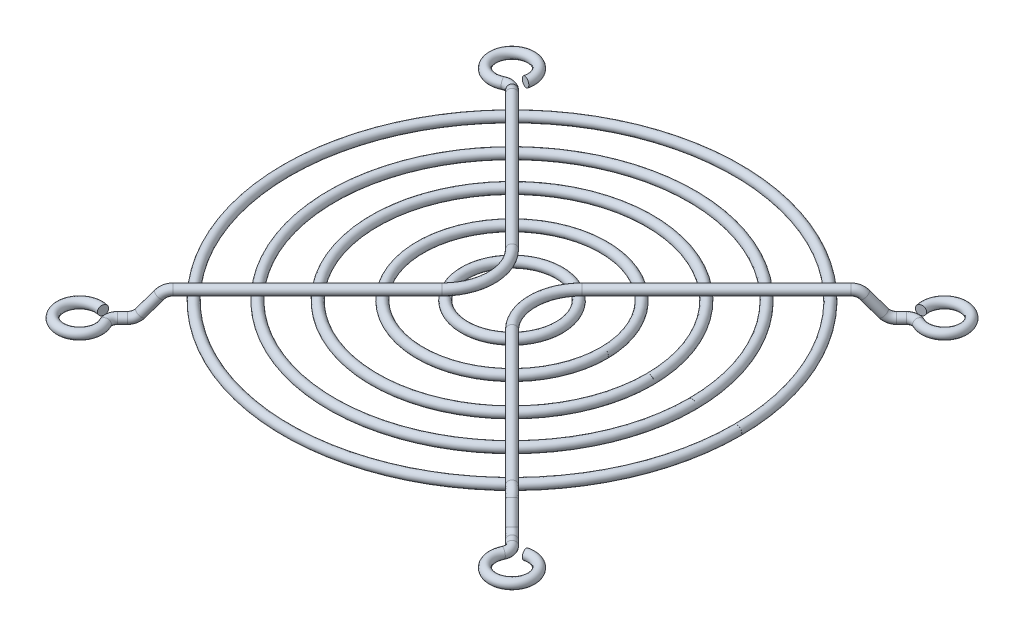
ISO-10303-21;
HEADER;
FILE_DESCRIPTION(('STEP AP214'),'2;1');
FILE_NAME('part.step','',(''),(''),'','','');
FILE_SCHEMA(('AUTOMOTIVE_DESIGN { 1 0 10303 214 1 1 1 1 }'));
ENDSEC;
DATA;
#1=APPLICATION_CONTEXT('core data for automotive mechanical design processes');
#2=APPLICATION_PROTOCOL_DEFINITION('international standard','automotive_design',2000,#1);
#3=PRODUCT_CONTEXT('',#1,'mechanical');
#4=PRODUCT('Part','Part','',(#3));
#5=PRODUCT_RELATED_PRODUCT_CATEGORY('part','',(#4));
#6=PRODUCT_DEFINITION_FORMATION('','',#4);
#7=PRODUCT_DEFINITION_CONTEXT('part definition',#1,'design');
#8=PRODUCT_DEFINITION('design','',#6,#7);
#9=PRODUCT_DEFINITION_SHAPE('','',#8);
#10=(LENGTH_UNIT() NAMED_UNIT(*) SI_UNIT(.MILLI.,.METRE.));
#11=(NAMED_UNIT(*) PLANE_ANGLE_UNIT() SI_UNIT($,.RADIAN.));
#12=(NAMED_UNIT(*) SI_UNIT($,.STERADIAN.) SOLID_ANGLE_UNIT());
#13=UNCERTAINTY_MEASURE_WITH_UNIT(LENGTH_MEASURE(1.E-05),#10,'distance_accuracy_value','');
#14=(GEOMETRIC_REPRESENTATION_CONTEXT(3) GLOBAL_UNCERTAINTY_ASSIGNED_CONTEXT((#13)) GLOBAL_UNIT_ASSIGNED_CONTEXT((#10,
#11,#12)) REPRESENTATION_CONTEXT('',''));
#15=CARTESIAN_POINT('',(0.,0.,0.));
#16=DIRECTION('',(0.,0.,1.));
#17=DIRECTION('',(1.,0.,0.));
#18=AXIS2_PLACEMENT_3D('',#15,#16,#17);
#19=CARTESIAN_POINT('',(-5.65685424949251,1.5,5.65685424949238));
#20=DIRECTION('',(-0.707106781186546,0.,0.707106781186549));
#21=DIRECTION('',(0.707106781186549,0.,0.707106781186546));
#22=AXIS2_PLACEMENT_3D('',#19,#20,#21);
#23=CYLINDRICAL_SURFACE('',#22,0.749999999999998);
#24=CARTESIAN_POINT('',(-5.65685424949251,1.5,5.65685424949238));
#25=DIRECTION('',(-0.70710678118655,0.,0.707106781186545));
#26=DIRECTION('',(0.707106781186545,0.,0.70710678118655));
#27=AXIS2_PLACEMENT_3D('',#24,#25,#26);
#28=CIRCLE('',#27,0.749999999999998);
#29=CARTESIAN_POINT('',(-5.1265241636026,1.5,6.18718433538229));
#30=VERTEX_POINT('',#29);
#31=EDGE_CURVE('E11',#30,#30,#28,.T.);
#32=ORIENTED_EDGE('',*,*,#31,.T.);
#33=EDGE_LOOP('',(#32));
#34=FACE_BOUND('',#33,.T.);
#35=CARTESIAN_POINT('',(-27.4519723458619,1.5,27.4519723458618));
#36=DIRECTION('',(-0.70710678118655,0.,0.707106781186545));
#37=DIRECTION('',(0.707106781186545,0.,0.70710678118655));
#38=AXIS2_PLACEMENT_3D('',#35,#36,#37);
#39=CIRCLE('',#38,0.750000000000034);
#40=CARTESIAN_POINT('',(-27.4519723458619,2.25000000000003,27.4519723458618));
#41=VERTEX_POINT('',#40);
#42=EDGE_CURVE('E59',#41,#41,#39,.T.);
#43=ORIENTED_EDGE('',*,*,#42,.F.);
#44=EDGE_LOOP('',(#43));
#45=FACE_BOUND('',#44,.T.);
#46=ADVANCED_FACE('F37',(#34,#45),#23,.T.);
#47=CARTESIAN_POINT('',(-11.3137084989849,1.5,0.));
#48=DIRECTION('',(0.,-1.,0.));
#49=DIRECTION('',(0.,0.,-1.));
#50=AXIS2_PLACEMENT_3D('',#47,#48,#49);
#51=TOROIDAL_SURFACE('',#50,7.99999999999998,0.749999999999998);
#52=CARTESIAN_POINT('',(-5.65685424949254,1.5,-5.65685424949236));
#53=DIRECTION('',(0.707106781186546,0.,0.707106781186549));
#54=DIRECTION('',(0.707106781186549,0.,-0.707106781186546));
#55=AXIS2_PLACEMENT_3D('',#52,#53,#54);
#56=CIRCLE('',#55,0.749999999999998);
#57=CARTESIAN_POINT('',(-5.12652416360263,1.5,-6.18718433538228));
#58=VERTEX_POINT('',#57);
#59=EDGE_CURVE('E43',#58,#58,#56,.T.);
#60=CARTESIAN_POINT('',(-11.3137084989849,1.5,0.));
#61=DIRECTION('',(0.,-1.,0.));
#62=DIRECTION('',(0.,0.,-1.));
#63=AXIS2_PLACEMENT_3D('',#60,#61,#62);
#64=CIRCLE('',#63,8.74999999999998);
#65=EDGE_CURVE('',#58,#30,#64,.T.);
#66=ORIENTED_EDGE('',*,*,#59,.T.);
#67=ORIENTED_EDGE('',*,*,#31,.F.);
#68=ORIENTED_EDGE('',*,*,#65,.T.);
#69=ORIENTED_EDGE('',*,*,#65,.F.);
#70=EDGE_LOOP('',(#66,#68,#67,#69));
#71=FACE_BOUND('',#70,.T.);
#72=ADVANCED_FACE('F113',(#71),#51,.T.);
#73=CARTESIAN_POINT('',(-5.65685424949254,1.5,-5.65685424949236));
#74=DIRECTION('',(-0.707106781186549,0.,-0.707106781186546));
#75=DIRECTION('',(-0.707106781186546,0.,0.707106781186549));
#76=AXIS2_PLACEMENT_3D('',#73,#74,#75);
#77=CYLINDRICAL_SURFACE('',#76,0.749999999999998);
#78=ORIENTED_EDGE('',*,*,#59,.F.);
#79=EDGE_LOOP('',(#78));
#80=FACE_BOUND('',#79,.T.);
#81=CARTESIAN_POINT('',(-27.4519723458619,1.5,-27.4519723458616));
#82=DIRECTION('',(-0.707106781186546,0.,-0.707106781186549));
#83=DIRECTION('',(-0.707106781186549,0.,0.707106781186546));
#84=AXIS2_PLACEMENT_3D('',#81,#82,#83);
#85=CIRCLE('',#84,0.750000000000001);
#86=CARTESIAN_POINT('',(-27.4519723458619,2.25,-27.4519723458616));
#87=VERTEX_POINT('',#86);
#88=EDGE_CURVE('E71',#87,#87,#85,.T.);
#89=ORIENTED_EDGE('',*,*,#88,.F.);
#90=EDGE_LOOP('',(#89));
#91=FACE_BOUND('',#90,.T.);
#92=ADVANCED_FACE('F117',(#80,#91),#77,.T.);
#93=CARTESIAN_POINT('',(-31.1442217318507,-2.5,31.1442217318506));
#94=DIRECTION('',(-0.707106781186545,0.,0.70710678118655));
#95=DIRECTION('',(0.70710678118655,0.,0.707106781186545));
#96=AXIS2_PLACEMENT_3D('',#93,#94,#95);
#97=CYLINDRICAL_SURFACE('',#96,0.750000000000034);
#98=CARTESIAN_POINT('',(-31.1442217318507,-2.5,31.1442217318506));
#99=DIRECTION('',(-0.70710678118655,0.,0.707106781186545));
#100=DIRECTION('',(0.707106781186545,0.,0.70710678118655));
#101=AXIS2_PLACEMENT_3D('',#98,#99,#100);
#102=CIRCLE('',#101,0.750000000000034);
#103=CARTESIAN_POINT('',(-31.1442217318507,-3.25000000000004,31.1442217318506));
#104=VERTEX_POINT('',#103);
#105=EDGE_CURVE('E47',#104,#104,#102,.T.);
#106=ORIENTED_EDGE('',*,*,#105,.T.);
#107=EDGE_LOOP('',(#106));
#108=FACE_BOUND('',#107,.T.);
#109=CARTESIAN_POINT('',(-31.9251016276957,-2.5,31.9251016276956));
#110=DIRECTION('',(-0.70710678118655,0.,0.707106781186545));
#111=DIRECTION('',(0.707106781186545,0.,0.70710678118655));
#112=AXIS2_PLACEMENT_3D('',#109,#110,#111);
#113=CIRCLE('',#112,0.750000000000021);
#114=CARTESIAN_POINT('',(-31.3947715418057,-2.5,32.4554317135855));
#115=VERTEX_POINT('',#114);
#116=EDGE_CURVE('E80',#115,#115,#113,.T.);
#117=ORIENTED_EDGE('',*,*,#116,.F.);
#118=EDGE_LOOP('',(#117));
#119=FACE_BOUND('',#118,.T.);
#120=ADVANCED_FACE('F131',(#108,#119),#97,.T.);
#121=CARTESIAN_POINT('',(-31.1442217318507,-0.5,31.1442217318506));
#122=DIRECTION('',(-0.707106781186546,0.,-0.707106781186549));
#123=DIRECTION('',(-0.707106781186549,0.,0.707106781186546));
#124=AXIS2_PLACEMENT_3D('',#121,#122,#123);
#125=TOROIDAL_SURFACE('',#124,2.,0.750000000000034);
#126=CARTESIAN_POINT('',(-30.0608712910113,-1.78557521937308,30.0608712910112));
#127=DIRECTION('',(-0.454519477672045,-0.766044443118979,0.454519477672041));
#128=DIRECTION('',(0.707106781186545,0.,0.70710678118655));
#129=AXIS2_PLACEMENT_3D('',#126,#127,#128);
#130=CIRCLE('',#129,0.750000000000034);
#131=CARTESIAN_POINT('',(-29.6546148756965,-2.26766592663801,29.6546148756964));
#132=VERTEX_POINT('',#131);
#133=EDGE_CURVE('E51',#132,#132,#130,.T.);
#134=CARTESIAN_POINT('',(-31.1442217318507,-0.5,31.1442217318506));
#135=DIRECTION('',(-0.707106781186546,0.,-0.707106781186549));
#136=DIRECTION('',(-0.707106781186549,0.,0.707106781186546));
#137=AXIS2_PLACEMENT_3D('',#134,#135,#136);
#138=CIRCLE('',#137,2.75000000000004);
#139=EDGE_CURVE('',#132,#104,#138,.T.);
#140=ORIENTED_EDGE('',*,*,#133,.T.);
#141=ORIENTED_EDGE('',*,*,#105,.F.);
#142=ORIENTED_EDGE('',*,*,#139,.T.);
#143=ORIENTED_EDGE('',*,*,#139,.F.);
#144=EDGE_LOOP('',(#140,#142,#141,#143));
#145=FACE_BOUND('',#144,.T.);
#146=ADVANCED_FACE('F125',(#145),#125,.T.);
#147=CARTESIAN_POINT('',(-28.5353227867013,0.785575219373072,28.5353227867012));
#148=DIRECTION('',(-0.454519477672044,-0.766044443118979,0.454519477672042));
#149=DIRECTION('',(0.860012120645905,-0.510273605374737,0.));
#150=AXIS2_PLACEMENT_3D('',#147,#148,#149);
#151=CYLINDRICAL_SURFACE('',#150,0.750000000000034);
#152=CARTESIAN_POINT('',(-28.5353227867013,0.785575219373072,28.5353227867012));
#153=DIRECTION('',(-0.454519477672045,-0.766044443118979,0.454519477672041));
#154=DIRECTION('',(0.707106781186545,0.,0.70710678118655));
#155=AXIS2_PLACEMENT_3D('',#152,#153,#154);
#156=CIRCLE('',#155,0.750000000000034);
#157=CARTESIAN_POINT('',(-28.9415792020161,1.267665926638,28.941579202016));
#158=VERTEX_POINT('',#157);
#159=EDGE_CURVE('E56',#158,#158,#156,.T.);
#160=ORIENTED_EDGE('',*,*,#159,.T.);
#161=EDGE_LOOP('',(#160));
#162=FACE_BOUND('',#161,.T.);
#163=ORIENTED_EDGE('',*,*,#133,.F.);
#164=EDGE_LOOP('',(#163));
#165=FACE_BOUND('',#164,.T.);
#166=ADVANCED_FACE('F109',(#162,#165),#151,.T.);
#167=CARTESIAN_POINT('',(-27.4519723458619,-0.5,27.4519723458618));
#168=DIRECTION('',(0.707106781186546,0.,0.707106781186549));
#169=DIRECTION('',(0.707106781186549,0.,-0.707106781186546));
#170=AXIS2_PLACEMENT_3D('',#167,#168,#169);
#171=TOROIDAL_SURFACE('',#170,2.,0.750000000000034);
#172=CARTESIAN_POINT('',(-27.4519723458619,-0.5,27.4519723458618));
#173=DIRECTION('',(0.707106781186546,0.,0.707106781186549));
#174=DIRECTION('',(0.707106781186549,0.,-0.707106781186546));
#175=AXIS2_PLACEMENT_3D('',#172,#173,#174);
#176=CIRCLE('',#175,2.75000000000003);
#177=EDGE_CURVE('',#41,#158,#176,.T.);
#178=ORIENTED_EDGE('',*,*,#42,.T.);
#179=ORIENTED_EDGE('',*,*,#159,.F.);
#180=ORIENTED_EDGE('',*,*,#177,.T.);
#181=ORIENTED_EDGE('',*,*,#177,.F.);
#182=EDGE_LOOP('',(#178,#180,#179,#181));
#183=FACE_BOUND('',#182,.T.);
#184=ADVANCED_FACE('F99',(#183),#171,.T.);
#185=CARTESIAN_POINT('',(-31.1442217318507,-2.5,-31.1442217318504));
#186=DIRECTION('',(-0.707106781186553,0.,-0.707106781186542));
#187=DIRECTION('',(-0.707106781186542,0.,0.707106781186553));
#188=AXIS2_PLACEMENT_3D('',#185,#186,#187);
#189=CYLINDRICAL_SURFACE('',#188,0.750000000000001);
#190=CARTESIAN_POINT('',(-31.1442217318507,-2.5,-31.1442217318504));
#191=DIRECTION('',(-0.707106781186546,0.,-0.707106781186549));
#192=DIRECTION('',(-0.707106781186549,0.,0.707106781186546));
#193=AXIS2_PLACEMENT_3D('',#190,#191,#192);
#194=CIRCLE('',#193,0.750000000000001);
#195=CARTESIAN_POINT('',(-31.1442217318507,-3.25,-31.1442217318504));
#196=VERTEX_POINT('',#195);
#197=EDGE_CURVE('E62',#196,#196,#194,.T.);
#198=ORIENTED_EDGE('',*,*,#197,.T.);
#199=EDGE_LOOP('',(#198));
#200=FACE_BOUND('',#199,.T.);
#201=CARTESIAN_POINT('',(-31.9251016276956,-2.5,-31.9251016276954));
#202=DIRECTION('',(-0.707106781186546,0.,-0.707106781186549));
#203=DIRECTION('',(-0.707106781186549,0.,0.707106781186546));
#204=AXIS2_PLACEMENT_3D('',#201,#202,#203);
#205=CIRCLE('',#204,0.749999999999996);
#206=CARTESIAN_POINT('',(-32.4554317135855,-2.5,-31.3947715418055));
#207=VERTEX_POINT('',#206);
#208=EDGE_CURVE('E89',#207,#207,#205,.T.);
#209=ORIENTED_EDGE('',*,*,#208,.F.);
#210=EDGE_LOOP('',(#209));
#211=FACE_BOUND('',#210,.T.);
#212=ADVANCED_FACE('F96',(#200,#211),#189,.T.);
#213=CARTESIAN_POINT('',(-31.1442217318507,-0.5,-31.1442217318504));
#214=DIRECTION('',(0.707106781186546,0.,-0.707106781186549));
#215=DIRECTION('',(-0.707106781186549,0.,-0.707106781186546));
#216=AXIS2_PLACEMENT_3D('',#213,#214,#215);
#217=TOROIDAL_SURFACE('',#216,2.,0.750000000000001);
#218=CARTESIAN_POINT('',(-30.0608712910113,-1.78557521937308,-30.060871291011));
#219=DIRECTION('',(-0.454519477672042,-0.766044443118977,-0.454519477672046));
#220=DIRECTION('',(-0.707106781186548,0.,0.707106781186547));
#221=AXIS2_PLACEMENT_3D('',#218,#219,#220);
#222=CIRCLE('',#221,0.750000000000001);
#223=CARTESIAN_POINT('',(-29.6546148756965,-2.26766592663798,-29.6546148756963));
#224=VERTEX_POINT('',#223);
#225=EDGE_CURVE('E65',#224,#224,#222,.T.);
#226=CARTESIAN_POINT('',(-31.1442217318507,-0.5,-31.1442217318504));
#227=DIRECTION('',(0.707106781186546,0.,-0.707106781186549));
#228=DIRECTION('',(-0.707106781186549,0.,-0.707106781186546));
#229=AXIS2_PLACEMENT_3D('',#226,#227,#228);
#230=CIRCLE('',#229,2.75);
#231=EDGE_CURVE('',#224,#196,#230,.T.);
#232=ORIENTED_EDGE('',*,*,#225,.T.);
#233=ORIENTED_EDGE('',*,*,#197,.F.);
#234=ORIENTED_EDGE('',*,*,#231,.T.);
#235=ORIENTED_EDGE('',*,*,#231,.F.);
#236=EDGE_LOOP('',(#232,#234,#233,#235));
#237=FACE_BOUND('',#236,.T.);
#238=ADVANCED_FACE('F98',(#237),#217,.T.);
#239=CARTESIAN_POINT('',(-28.5353227867013,0.785575219373082,-28.535322786701));
#240=DIRECTION('',(-0.454519477672046,-0.766044443118977,-0.454519477672043));
#241=DIRECTION('',(0.860012120645904,-0.510273605374739,0.));
#242=AXIS2_PLACEMENT_3D('',#239,#240,#241);
#243=CYLINDRICAL_SURFACE('',#242,0.750000000000001);
#244=CARTESIAN_POINT('',(-28.5353227867013,0.785575219373082,-28.535322786701));
#245=DIRECTION('',(-0.454519477672042,-0.766044443118977,-0.454519477672046));
#246=DIRECTION('',(-0.707106781186548,0.,0.707106781186547));
#247=AXIS2_PLACEMENT_3D('',#244,#245,#246);
#248=CIRCLE('',#247,0.750000000000001);
#249=CARTESIAN_POINT('',(-28.941579202016,1.26766592663799,-28.9415792020158));
#250=VERTEX_POINT('',#249);
#251=EDGE_CURVE('E68',#250,#250,#248,.T.);
#252=ORIENTED_EDGE('',*,*,#251,.T.);
#253=EDGE_LOOP('',(#252));
#254=FACE_BOUND('',#253,.T.);
#255=ORIENTED_EDGE('',*,*,#225,.F.);
#256=EDGE_LOOP('',(#255));
#257=FACE_BOUND('',#256,.T.);
#258=ADVANCED_FACE('F106',(#254,#257),#243,.T.);
#259=CARTESIAN_POINT('',(-27.4519723458619,-0.5,-27.4519723458616));
#260=DIRECTION('',(-0.707106781186546,0.,0.707106781186549));
#261=DIRECTION('',(0.707106781186549,0.,0.707106781186546));
#262=AXIS2_PLACEMENT_3D('',#259,#260,#261);
#263=TOROIDAL_SURFACE('',#262,2.,0.750000000000001);
#264=CARTESIAN_POINT('',(-27.4519723458619,-0.5,-27.4519723458616));
#265=DIRECTION('',(-0.707106781186546,0.,0.707106781186549));
#266=DIRECTION('',(0.707106781186549,0.,0.707106781186546));
#267=AXIS2_PLACEMENT_3D('',#264,#265,#266);
#268=CIRCLE('',#267,2.75);
#269=EDGE_CURVE('',#87,#250,#268,.T.);
#270=ORIENTED_EDGE('',*,*,#88,.T.);
#271=ORIENTED_EDGE('',*,*,#251,.F.);
#272=ORIENTED_EDGE('',*,*,#269,.T.);
#273=ORIENTED_EDGE('',*,*,#269,.F.);
#274=EDGE_LOOP('',(#270,#272,#271,#273));
#275=FACE_BOUND('',#274,.T.);
#276=ADVANCED_FACE('F150',(#275),#263,.T.);
#277=CARTESIAN_POINT('',(-35.,-2.5,35.));
#278=DIRECTION('',(0.,-1.,0.));
#279=DIRECTION('',(0.,0.,-1.));
#280=AXIS2_PLACEMENT_3D('',#277,#278,#279);
#281=TOROIDAL_SURFACE('',#280,3.09999999999997,0.750000000000021);
#282=CARTESIAN_POINT('',(-32.2129931550737,-2.5,33.6425786039943));
#283=DIRECTION('',(0.437877869679252,0.,0.899034466105254));
#284=DIRECTION('',(0.899034466105254,0.,-0.437877869679252));
#285=AXIS2_PLACEMENT_3D('',#282,#283,#284);
#286=CIRCLE('',#285,0.750000000000021);
#287=CARTESIAN_POINT('',(-31.5387173054948,-2.5,33.3141702017349));
#288=VERTEX_POINT('',#287);
#289=EDGE_CURVE('E77',#288,#288,#286,.T.);
#290=CARTESIAN_POINT('',(-34.1976609601822,-2.5,32.0056299385039));
#291=DIRECTION('',(0.965925826289066,0.,0.258819045102529));
#292=DIRECTION('',(0.258819045102529,0.,-0.965925826289066));
#293=AXIS2_PLACEMENT_3D('',#290,#291,#292);
#294=CIRCLE('',#293,0.750000000000021);
#295=CARTESIAN_POINT('',(-34.0035466763553,-2.5,31.2811855687871));
#296=VERTEX_POINT('',#295);
#297=EDGE_CURVE('E74',#296,#296,#294,.T.);
#298=CARTESIAN_POINT('',(-35.,-2.5,35.));
#299=DIRECTION('',(0.,-1.,0.));
#300=DIRECTION('',(0.,0.,-1.));
#301=AXIS2_PLACEMENT_3D('',#298,#299,#300);
#302=CIRCLE('',#301,3.84999999999999);
#303=EDGE_CURVE('',#288,#296,#302,.T.);
#304=ORIENTED_EDGE('',*,*,#289,.T.);
#305=ORIENTED_EDGE('',*,*,#297,.F.);
#306=ORIENTED_EDGE('',*,*,#303,.T.);
#307=ORIENTED_EDGE('',*,*,#303,.F.);
#308=EDGE_LOOP('',(#304,#306,#305,#307));
#309=FACE_BOUND('',#308,.T.);
#310=ADVANCED_FACE('F144',(#309),#281,.T.);
#311=CARTESIAN_POINT('',(-30.8644414559158,-2.5,32.9857617994755));
#312=DIRECTION('',(0.,1.,0.));
#313=DIRECTION('',(0.,0.,1.));
#314=AXIS2_PLACEMENT_3D('',#311,#312,#313);
#315=TOROIDAL_SURFACE('',#314,1.50000000000001,0.750000000000021);
#316=ORIENTED_EDGE('',*,*,#116,.T.);
#317=EDGE_LOOP('',(#316));
#318=FACE_BOUND('',#317,.T.);
#319=ORIENTED_EDGE('',*,*,#289,.F.);
#320=EDGE_LOOP('',(#319));
#321=FACE_BOUND('',#320,.T.);
#322=ADVANCED_FACE('F140',(#318,#321),#315,.T.);
#323=CARTESIAN_POINT('',(-34.1976609601822,-2.5,32.0056299385039));
#324=DIRECTION('',(0.965925826289066,0.,0.258819045102529));
#325=DIRECTION('',(0.258819045102529,0.,-0.965925826289066));
#326=AXIS2_PLACEMENT_3D('',#323,#324,#325);
#327=PLANE('',#326);
#328=ORIENTED_EDGE('',*,*,#297,.T.);
#329=EDGE_LOOP('',(#328));
#330=FACE_BOUND('',#329,.T.);
#331=ADVANCED_FACE('F143',(#330),#327,.T.);
#332=CARTESIAN_POINT('',(-35.,-2.5,-34.9999999999997));
#333=DIRECTION('',(0.,-1.,0.));
#334=DIRECTION('',(0.,0.,-1.));
#335=AXIS2_PLACEMENT_3D('',#332,#333,#334);
#336=TOROIDAL_SURFACE('',#335,3.1,0.749999999999996);
#337=CARTESIAN_POINT('',(-33.6425786039943,-2.5,-32.2129931550734));
#338=DIRECTION('',(-0.899034466105257,0.,0.437877869679248));
#339=DIRECTION('',(0.437877869679248,0.,0.899034466105257));
#340=AXIS2_PLACEMENT_3D('',#337,#338,#339);
#341=CIRCLE('',#340,0.749999999999996);
#342=CARTESIAN_POINT('',(-33.3141702017349,-2.5,-31.5387173054945));
#343=VERTEX_POINT('',#342);
#344=EDGE_CURVE('E86',#343,#343,#341,.T.);
#345=CARTESIAN_POINT('',(-32.0056299385039,-2.5,-34.1976609601819));
#346=DIRECTION('',(-0.258819045102533,0.,0.965925826289065));
#347=DIRECTION('',(0.965925826289065,0.,0.258819045102533));
#348=AXIS2_PLACEMENT_3D('',#345,#346,#347);
#349=CIRCLE('',#348,0.749999999999996);
#350=CARTESIAN_POINT('',(-31.2811855687871,-2.5,-34.003546676355));
#351=VERTEX_POINT('',#350);
#352=EDGE_CURVE('E83',#351,#351,#349,.T.);
#353=CARTESIAN_POINT('',(-35.,-2.5,-34.9999999999997));
#354=DIRECTION('',(0.,-1.,0.));
#355=DIRECTION('',(0.,0.,-1.));
#356=AXIS2_PLACEMENT_3D('',#353,#354,#355);
#357=CIRCLE('',#356,3.85);
#358=EDGE_CURVE('',#343,#351,#357,.T.);
#359=ORIENTED_EDGE('',*,*,#344,.T.);
#360=ORIENTED_EDGE('',*,*,#352,.F.);
#361=ORIENTED_EDGE('',*,*,#358,.T.);
#362=ORIENTED_EDGE('',*,*,#358,.F.);
#363=EDGE_LOOP('',(#359,#361,#360,#362));
#364=FACE_BOUND('',#363,.T.);
#365=ADVANCED_FACE('F155',(#364),#336,.T.);
#366=CARTESIAN_POINT('',(-32.9857617994755,-2.5,-30.8644414559156));
#367=DIRECTION('',(0.,1.,0.));
#368=DIRECTION('',(0.,0.,1.));
#369=AXIS2_PLACEMENT_3D('',#366,#367,#368);
#370=TOROIDAL_SURFACE('',#369,1.5,0.749999999999996);
#371=ORIENTED_EDGE('',*,*,#208,.T.);
#372=EDGE_LOOP('',(#371));
#373=FACE_BOUND('',#372,.T.);
#374=ORIENTED_EDGE('',*,*,#344,.F.);
#375=EDGE_LOOP('',(#374));
#376=FACE_BOUND('',#375,.T.);
#377=ADVANCED_FACE('F93',(#373,#376),#370,.T.);
#378=CARTESIAN_POINT('',(-32.0056299385039,-2.5,-34.1976609601819));
#379=DIRECTION('',(-0.258819045102533,0.,0.965925826289065));
#380=DIRECTION('',(0.965925826289065,0.,0.258819045102533));
#381=AXIS2_PLACEMENT_3D('',#378,#379,#380);
#382=PLANE('',#381);
#383=ORIENTED_EDGE('',*,*,#352,.T.);
#384=EDGE_LOOP('',(#383));
#385=FACE_BOUND('',#384,.T.);
#386=ADVANCED_FACE('F216',(#385),#382,.T.);
#387=CLOSED_SHELL('',(#46,#72,#92,#120,#146,#166,#184,#212,#238,#258,#276,#310,#322,#331,#365,
#377,#386));
#388=MANIFOLD_SOLID_BREP('B2',#387);
#389=CARTESIAN_POINT('',(5.65685424949251,1.5,5.65685424949239));
#390=DIRECTION('',(0.707106781186546,0.,0.707106781186549));
#391=DIRECTION('',(0.707106781186549,0.,-0.707106781186546));
#392=AXIS2_PLACEMENT_3D('',#389,#390,#391);
#393=CYLINDRICAL_SURFACE('',#392,0.749999999999998);
#394=CARTESIAN_POINT('',(5.65685424949251,1.5,5.65685424949239));
#395=DIRECTION('',(-0.70710678118655,0.,-0.707106781186545));
#396=DIRECTION('',(-0.707106781186545,0.,0.70710678118655));
#397=AXIS2_PLACEMENT_3D('',#394,#395,#396);
#398=CIRCLE('',#397,0.749999999999998);
#399=CARTESIAN_POINT('',(5.1265241636026,1.5,6.1871843353823));
#400=VERTEX_POINT('',#399);
#401=EDGE_CURVE('E36',#400,#400,#398,.T.);
#402=ORIENTED_EDGE('',*,*,#401,.F.);
#403=EDGE_LOOP('',(#402));
#404=FACE_BOUND('',#403,.T.);
#405=CARTESIAN_POINT('',(27.4519723458619,1.5,27.4519723458618));
#406=DIRECTION('',(0.707106781186549,0.,0.707106781186546));
#407=DIRECTION('',(0.707106781186546,0.,-0.707106781186549));
#408=AXIS2_PLACEMENT_3D('',#405,#406,#407);
#409=CIRCLE('',#408,0.75000000000002);
#410=CARTESIAN_POINT('',(27.4519723458619,2.25000000000002,27.4519723458618));
#411=VERTEX_POINT('',#410);
#412=EDGE_CURVE('E341',#411,#411,#409,.T.);
#413=ORIENTED_EDGE('',*,*,#412,.F.);
#414=EDGE_LOOP('',(#413));
#415=FACE_BOUND('',#414,.T.);
#416=ADVANCED_FACE('F307',(#404,#415),#393,.T.);
#417=CARTESIAN_POINT('',(11.3137084989849,1.5,0.));
#418=DIRECTION('',(0.,1.,0.));
#419=DIRECTION('',(0.,0.,1.));
#420=AXIS2_PLACEMENT_3D('',#417,#418,#419);
#421=TOROIDAL_SURFACE('',#420,7.99999999999999,0.749999999999998);
#422=CARTESIAN_POINT('',(5.65685424949253,1.5,-5.65685424949237));
#423=DIRECTION('',(0.707106781186546,0.,-0.707106781186549));
#424=DIRECTION('',(-0.707106781186549,0.,-0.707106781186546));
#425=AXIS2_PLACEMENT_3D('',#422,#423,#424);
#426=CIRCLE('',#425,0.749999999999998);
#427=CARTESIAN_POINT('',(5.12652416360262,1.5,-6.18718433538228));
#428=VERTEX_POINT('',#427);
#429=EDGE_CURVE('E313',#428,#428,#426,.T.);
#430=CARTESIAN_POINT('',(11.3137084989849,1.5,0.));
#431=DIRECTION('',(0.,1.,0.));
#432=DIRECTION('',(0.,0.,1.));
#433=AXIS2_PLACEMENT_3D('',#430,#431,#432);
#434=CIRCLE('',#433,8.74999999999999);
#435=EDGE_CURVE('',#428,#400,#434,.T.);
#436=ORIENTED_EDGE('',*,*,#429,.F.);
#437=ORIENTED_EDGE('',*,*,#401,.T.);
#438=ORIENTED_EDGE('',*,*,#435,.T.);
#439=ORIENTED_EDGE('',*,*,#435,.F.);
#440=EDGE_LOOP('',(#436,#438,#437,#439));
#441=FACE_BOUND('',#440,.T.);
#442=ADVANCED_FACE('F379',(#441),#421,.T.);
#443=CARTESIAN_POINT('',(5.65685424949253,1.5,-5.65685424949237));
#444=DIRECTION('',(0.707106781186549,0.,-0.707106781186546));
#445=DIRECTION('',(-0.707106781186546,0.,-0.707106781186549));
#446=AXIS2_PLACEMENT_3D('',#443,#444,#445);
#447=CYLINDRICAL_SURFACE('',#446,0.749999999999998);
#448=ORIENTED_EDGE('',*,*,#429,.T.);
#449=EDGE_LOOP('',(#448));
#450=FACE_BOUND('',#449,.T.);
#451=CARTESIAN_POINT('',(27.4519723458619,1.5,-27.4519723458616));
#452=DIRECTION('',(0.707106781186546,0.,-0.707106781186549));
#453=DIRECTION('',(-0.707106781186549,0.,-0.707106781186546));
#454=AXIS2_PLACEMENT_3D('',#451,#452,#453);
#455=CIRCLE('',#454,0.750000000000001);
#456=CARTESIAN_POINT('',(27.4519723458619,2.25,-27.4519723458616));
#457=VERTEX_POINT('',#456);
#458=EDGE_CURVE('E329',#457,#457,#455,.T.);
#459=ORIENTED_EDGE('',*,*,#458,.F.);
#460=EDGE_LOOP('',(#459));
#461=FACE_BOUND('',#460,.T.);
#462=ADVANCED_FACE('F369',(#450,#461),#447,.T.);
#463=CARTESIAN_POINT('',(31.1442217318507,-2.5,-31.1442217318504));
#464=DIRECTION('',(0.707106781186553,0.,-0.707106781186542));
#465=DIRECTION('',(-0.707106781186542,0.,-0.707106781186553));
#466=AXIS2_PLACEMENT_3D('',#463,#464,#465);
#467=CYLINDRICAL_SURFACE('',#466,0.750000000000001);
#468=CARTESIAN_POINT('',(31.1442217318507,-2.5,-31.1442217318504));
#469=DIRECTION('',(0.707106781186546,0.,-0.707106781186549));
#470=DIRECTION('',(-0.707106781186549,0.,-0.707106781186546));
#471=AXIS2_PLACEMENT_3D('',#468,#469,#470);
#472=CIRCLE('',#471,0.750000000000001);
#473=CARTESIAN_POINT('',(31.1442217318507,-3.25,-31.1442217318504));
#474=VERTEX_POINT('',#473);
#475=EDGE_CURVE('E317',#474,#474,#472,.T.);
#476=ORIENTED_EDGE('',*,*,#475,.T.);
#477=EDGE_LOOP('',(#476));
#478=FACE_BOUND('',#477,.T.);
#479=CARTESIAN_POINT('',(31.9251016276957,-2.5,-31.9251016276955));
#480=DIRECTION('',(0.707106781186546,0.,-0.707106781186549));
#481=DIRECTION('',(-0.707106781186549,0.,-0.707106781186546));
#482=AXIS2_PLACEMENT_3D('',#479,#480,#481);
#483=CIRCLE('',#482,0.749999999999996);
#484=CARTESIAN_POINT('',(31.3947715418058,-2.5,-32.4554317135854));
#485=VERTEX_POINT('',#484);
#486=EDGE_CURVE('E359',#485,#485,#483,.T.);
#487=ORIENTED_EDGE('',*,*,#486,.F.);
#488=EDGE_LOOP('',(#487));
#489=FACE_BOUND('',#488,.T.);
#490=ADVANCED_FACE('F366',(#478,#489),#467,.T.);
#491=CARTESIAN_POINT('',(31.1442217318507,-0.5,-31.1442217318504));
#492=DIRECTION('',(0.707106781186546,0.,0.707106781186549));
#493=DIRECTION('',(0.707106781186549,0.,-0.707106781186546));
#494=AXIS2_PLACEMENT_3D('',#491,#492,#493);
#495=TOROIDAL_SURFACE('',#494,2.,0.750000000000001);
#496=CARTESIAN_POINT('',(30.0608712910113,-1.78557521937308,-30.060871291011));
#497=DIRECTION('',(0.454519477672042,-0.766044443118977,-0.454519477672046));
#498=DIRECTION('',(-0.707106781186548,0.,-0.707106781186547));
#499=AXIS2_PLACEMENT_3D('',#496,#497,#498);
#500=CIRCLE('',#499,0.750000000000001);
#501=CARTESIAN_POINT('',(29.6546148756965,-2.26766592663798,-29.6546148756963));
#502=VERTEX_POINT('',#501);
#503=EDGE_CURVE('E321',#502,#502,#500,.T.);
#504=CARTESIAN_POINT('',(31.1442217318507,-0.5,-31.1442217318504));
#505=DIRECTION('',(0.707106781186546,0.,0.707106781186549));
#506=DIRECTION('',(0.707106781186549,0.,-0.707106781186546));
#507=AXIS2_PLACEMENT_3D('',#504,#505,#506);
#508=CIRCLE('',#507,2.75);
#509=EDGE_CURVE('',#502,#474,#508,.T.);
#510=ORIENTED_EDGE('',*,*,#503,.T.);
#511=ORIENTED_EDGE('',*,*,#475,.F.);
#512=ORIENTED_EDGE('',*,*,#509,.T.);
#513=ORIENTED_EDGE('',*,*,#509,.F.);
#514=EDGE_LOOP('',(#510,#512,#511,#513));
#515=FACE_BOUND('',#514,.T.);
#516=ADVANCED_FACE('F368',(#515),#495,.T.);
#517=CARTESIAN_POINT('',(28.5353227867013,0.785575219373082,-28.535322786701));
#518=DIRECTION('',(0.454519477672046,-0.766044443118977,-0.454519477672043));
#519=DIRECTION('',(0.860012120645904,0.510273605374739,0.));
#520=AXIS2_PLACEMENT_3D('',#517,#518,#519);
#521=CYLINDRICAL_SURFACE('',#520,0.750000000000001);
#522=CARTESIAN_POINT('',(28.5353227867013,0.785575219373082,-28.535322786701));
#523=DIRECTION('',(0.454519477672042,-0.766044443118977,-0.454519477672046));
#524=DIRECTION('',(-0.707106781186548,0.,-0.707106781186547));
#525=AXIS2_PLACEMENT_3D('',#522,#523,#524);
#526=CIRCLE('',#525,0.750000000000001);
#527=CARTESIAN_POINT('',(28.941579202016,1.26766592663799,-28.9415792020158));
#528=VERTEX_POINT('',#527);
#529=EDGE_CURVE('E326',#528,#528,#526,.T.);
#530=ORIENTED_EDGE('',*,*,#529,.T.);
#531=EDGE_LOOP('',(#530));
#532=FACE_BOUND('',#531,.T.);
#533=ORIENTED_EDGE('',*,*,#503,.F.);
#534=EDGE_LOOP('',(#533));
#535=FACE_BOUND('',#534,.T.);
#536=ADVANCED_FACE('F376',(#532,#535),#521,.T.);
#537=CARTESIAN_POINT('',(27.4519723458619,-0.5,-27.4519723458616));
#538=DIRECTION('',(-0.707106781186546,0.,-0.707106781186549));
#539=DIRECTION('',(-0.707106781186549,0.,0.707106781186546));
#540=AXIS2_PLACEMENT_3D('',#537,#538,#539);
#541=TOROIDAL_SURFACE('',#540,2.,0.750000000000001);
#542=CARTESIAN_POINT('',(27.4519723458619,-0.5,-27.4519723458616));
#543=DIRECTION('',(-0.707106781186546,0.,-0.707106781186549));
#544=DIRECTION('',(-0.707106781186549,0.,0.707106781186546));
#545=AXIS2_PLACEMENT_3D('',#542,#543,#544);
#546=CIRCLE('',#545,2.75);
#547=EDGE_CURVE('',#457,#528,#546,.T.);
#548=ORIENTED_EDGE('',*,*,#458,.T.);
#549=ORIENTED_EDGE('',*,*,#529,.F.);
#550=ORIENTED_EDGE('',*,*,#547,.T.);
#551=ORIENTED_EDGE('',*,*,#547,.F.);
#552=EDGE_LOOP('',(#548,#550,#549,#551));
#553=FACE_BOUND('',#552,.T.);
#554=ADVANCED_FACE('F412',(#553),#541,.T.);
#555=CARTESIAN_POINT('',(31.1442217318507,-2.5,31.1442217318506));
#556=DIRECTION('',(0.707106781186553,0.,0.707106781186542));
#557=DIRECTION('',(0.707106781186542,0.,-0.707106781186553));
#558=AXIS2_PLACEMENT_3D('',#555,#556,#557);
#559=CYLINDRICAL_SURFACE('',#558,0.75000000000002);
#560=CARTESIAN_POINT('',(31.1442217318507,-2.5,31.1442217318506));
#561=DIRECTION('',(0.707106781186549,0.,0.707106781186546));
#562=DIRECTION('',(0.707106781186546,0.,-0.70710678118655));
#563=AXIS2_PLACEMENT_3D('',#560,#561,#562);
#564=CIRCLE('',#563,0.75000000000002);
#565=CARTESIAN_POINT('',(31.1442217318507,-3.25000000000002,31.1442217318506));
#566=VERTEX_POINT('',#565);
#567=EDGE_CURVE('E332',#566,#566,#564,.T.);
#568=ORIENTED_EDGE('',*,*,#567,.T.);
#569=EDGE_LOOP('',(#568));
#570=FACE_BOUND('',#569,.T.);
#571=CARTESIAN_POINT('',(31.9251016276957,-2.49999999999999,31.9251016276956));
#572=DIRECTION('',(0.707106781186549,0.,0.707106781186546));
#573=DIRECTION('',(0.707106781186546,0.,-0.707106781186549));
#574=AXIS2_PLACEMENT_3D('',#571,#572,#573);
#575=CIRCLE('',#574,0.750000000000004);
#576=CARTESIAN_POINT('',(32.4554317135856,-2.49999999999999,31.3947715418057));
#577=VERTEX_POINT('',#576);
#578=EDGE_CURVE('E350',#577,#577,#575,.T.);
#579=ORIENTED_EDGE('',*,*,#578,.F.);
#580=EDGE_LOOP('',(#579));
#581=FACE_BOUND('',#580,.T.);
#582=ADVANCED_FACE('F406',(#570,#581),#559,.T.);
#583=CARTESIAN_POINT('',(31.1442217318507,-0.5,31.1442217318506));
#584=DIRECTION('',(-0.707106781186546,0.,0.707106781186549));
#585=DIRECTION('',(0.707106781186549,0.,0.707106781186546));
#586=AXIS2_PLACEMENT_3D('',#583,#584,#585);
#587=TOROIDAL_SURFACE('',#586,2.,0.75000000000002);
#588=CARTESIAN_POINT('',(30.0608712910113,-1.78557521937308,30.0608712910112));
#589=DIRECTION('',(0.454519477672045,-0.766044443118978,0.454519477672042));
#590=DIRECTION('',(0.707106781186546,0.,-0.707106781186549));
#591=AXIS2_PLACEMENT_3D('',#588,#589,#590);
#592=CIRCLE('',#591,0.75000000000002);
#593=CARTESIAN_POINT('',(29.6546148756965,-2.26766592663799,29.6546148756964));
#594=VERTEX_POINT('',#593);
#595=EDGE_CURVE('E335',#594,#594,#592,.T.);
#596=CARTESIAN_POINT('',(31.1442217318507,-0.5,31.1442217318506));
#597=DIRECTION('',(-0.707106781186546,0.,0.707106781186549));
#598=DIRECTION('',(0.707106781186549,0.,0.707106781186546));
#599=AXIS2_PLACEMENT_3D('',#596,#597,#598);
#600=CIRCLE('',#599,2.75000000000002);
#601=EDGE_CURVE('',#594,#566,#600,.T.);
#602=ORIENTED_EDGE('',*,*,#595,.T.);
#603=ORIENTED_EDGE('',*,*,#567,.F.);
#604=ORIENTED_EDGE('',*,*,#601,.T.);
#605=ORIENTED_EDGE('',*,*,#601,.F.);
#606=EDGE_LOOP('',(#602,#604,#603,#605));
#607=FACE_BOUND('',#606,.T.);
#608=ADVANCED_FACE('F400',(#607),#587,.T.);
#609=CARTESIAN_POINT('',(28.5353227867013,0.785575219373086,28.5353227867012));
#610=DIRECTION('',(0.454519477672043,-0.766044443118979,0.454519477672042));
#611=DIRECTION('',(0.860012120645906,0.510273605374736,0.));
#612=AXIS2_PLACEMENT_3D('',#609,#610,#611);
#613=CYLINDRICAL_SURFACE('',#612,0.75000000000002);
#614=CARTESIAN_POINT('',(28.5353227867013,0.785575219373086,28.5353227867012));
#615=DIRECTION('',(0.454519477672045,-0.766044443118978,0.454519477672042));
#616=DIRECTION('',(0.707106781186546,0.,-0.707106781186549));
#617=AXIS2_PLACEMENT_3D('',#614,#615,#616);
#618=CIRCLE('',#617,0.75000000000002);
#619=CARTESIAN_POINT('',(28.9415792020161,1.267665926638,28.941579202016));
#620=VERTEX_POINT('',#619);
#621=EDGE_CURVE('E338',#620,#620,#618,.T.);
#622=ORIENTED_EDGE('',*,*,#621,.T.);
#623=EDGE_LOOP('',(#622));
#624=FACE_BOUND('',#623,.T.);
#625=ORIENTED_EDGE('',*,*,#595,.F.);
#626=EDGE_LOOP('',(#625));
#627=FACE_BOUND('',#626,.T.);
#628=ADVANCED_FACE('F394',(#624,#627),#613,.T.);
#629=CARTESIAN_POINT('',(27.4519723458619,-0.5,27.4519723458618));
#630=DIRECTION('',(0.707106781186546,0.,-0.707106781186549));
#631=DIRECTION('',(-0.707106781186549,0.,-0.707106781186546));
#632=AXIS2_PLACEMENT_3D('',#629,#630,#631);
#633=TOROIDAL_SURFACE('',#632,2.,0.75000000000002);
#634=CARTESIAN_POINT('',(27.4519723458619,-0.5,27.4519723458618));
#635=DIRECTION('',(0.707106781186546,0.,-0.707106781186549));
#636=DIRECTION('',(-0.707106781186549,0.,-0.707106781186546));
#637=AXIS2_PLACEMENT_3D('',#634,#635,#636);
#638=CIRCLE('',#637,2.75000000000002);
#639=EDGE_CURVE('',#411,#620,#638,.T.);
#640=ORIENTED_EDGE('',*,*,#412,.T.);
#641=ORIENTED_EDGE('',*,*,#621,.F.);
#642=ORIENTED_EDGE('',*,*,#639,.T.);
#643=ORIENTED_EDGE('',*,*,#639,.F.);
#644=EDGE_LOOP('',(#640,#642,#641,#643));
#645=FACE_BOUND('',#644,.T.);
#646=ADVANCED_FACE('F390',(#645),#633,.T.);
#647=CARTESIAN_POINT('',(35.0000000000001,-2.49999999999999,35.));
#648=DIRECTION('',(0.,1.,0.));
#649=DIRECTION('',(0.,0.,1.));
#650=AXIS2_PLACEMENT_3D('',#647,#648,#649);
#651=TOROIDAL_SURFACE('',#650,3.1,0.750000000000004);
#652=CARTESIAN_POINT('',(32.2129931550738,-2.49999999999999,33.6425786039943));
#653=DIRECTION('',(-0.437877869679243,0.,0.899034466105259));
#654=DIRECTION('',(0.899034466105259,0.,0.437877869679243));
#655=AXIS2_PLACEMENT_3D('',#652,#653,#654);
#656=CIRCLE('',#655,0.750000000000004);
#657=CARTESIAN_POINT('',(31.5387173054948,-2.49999999999999,33.3141702017349));
#658=VERTEX_POINT('',#657);
#659=EDGE_CURVE('E347',#658,#658,#656,.T.);
#660=CARTESIAN_POINT('',(34.1976609601822,-2.49999999999999,32.0056299385039));
#661=DIRECTION('',(-0.965925826289065,0.,0.258819045102533));
#662=DIRECTION('',(0.258819045102533,0.,0.965925826289065));
#663=AXIS2_PLACEMENT_3D('',#660,#661,#662);
#664=CIRCLE('',#663,0.750000000000004);
#665=CARTESIAN_POINT('',(34.0035466763553,-2.49999999999999,31.2811855687871));
#666=VERTEX_POINT('',#665);
#667=EDGE_CURVE('E344',#666,#666,#664,.T.);
#668=CARTESIAN_POINT('',(35.0000000000001,-2.49999999999999,35.));
#669=DIRECTION('',(0.,1.,0.));
#670=DIRECTION('',(0.,0.,1.));
#671=AXIS2_PLACEMENT_3D('',#668,#669,#670);
#672=CIRCLE('',#671,3.85);
#673=EDGE_CURVE('',#658,#666,#672,.T.);
#674=ORIENTED_EDGE('',*,*,#659,.T.);
#675=ORIENTED_EDGE('',*,*,#667,.F.);
#676=ORIENTED_EDGE('',*,*,#673,.T.);
#677=ORIENTED_EDGE('',*,*,#673,.F.);
#678=EDGE_LOOP('',(#674,#676,#675,#677));
#679=FACE_BOUND('',#678,.T.);
#680=ADVANCED_FACE('F393',(#679),#651,.T.);
#681=CARTESIAN_POINT('',(30.8644414559159,-2.49999999999999,32.9857617994755));
#682=DIRECTION('',(0.,-1.,0.));
#683=DIRECTION('',(0.,0.,-1.));
#684=AXIS2_PLACEMENT_3D('',#681,#682,#683);
#685=TOROIDAL_SURFACE('',#684,1.50000000000001,0.750000000000004);
#686=ORIENTED_EDGE('',*,*,#578,.T.);
#687=EDGE_LOOP('',(#686));
#688=FACE_BOUND('',#687,.T.);
#689=ORIENTED_EDGE('',*,*,#659,.F.);
#690=EDGE_LOOP('',(#689));
#691=FACE_BOUND('',#690,.T.);
#692=ADVANCED_FACE('F416',(#688,#691),#685,.T.);
#693=CARTESIAN_POINT('',(34.1976609601822,-2.49999999999999,32.0056299385039));
#694=DIRECTION('',(-0.965925826289065,0.,0.258819045102533));
#695=DIRECTION('',(0.258819045102533,0.,0.965925826289065));
#696=AXIS2_PLACEMENT_3D('',#693,#694,#695);
#697=PLANE('',#696);
#698=ORIENTED_EDGE('',*,*,#667,.T.);
#699=EDGE_LOOP('',(#698));
#700=FACE_BOUND('',#699,.T.);
#701=ADVANCED_FACE('F419',(#700),#697,.T.);
#702=CARTESIAN_POINT('',(35.0000000000001,-2.5,-34.9999999999998));
#703=DIRECTION('',(0.,1.,0.));
#704=DIRECTION('',(0.,0.,1.));
#705=AXIS2_PLACEMENT_3D('',#702,#703,#704);
#706=TOROIDAL_SURFACE('',#705,3.10000000000001,0.749999999999996);
#707=CARTESIAN_POINT('',(33.6425786039944,-2.5,-32.2129931550735));
#708=DIRECTION('',(0.899034466105257,0.,0.437877869679248));
#709=DIRECTION('',(0.437877869679248,0.,-0.899034466105257));
#710=AXIS2_PLACEMENT_3D('',#707,#708,#709);
#711=CIRCLE('',#710,0.749999999999996);
#712=CARTESIAN_POINT('',(33.314170201735,-2.5,-31.5387173054946));
#713=VERTEX_POINT('',#712);
#714=EDGE_CURVE('E356',#713,#713,#711,.T.);
#715=CARTESIAN_POINT('',(32.005629938504,-2.5,-34.197660960182));
#716=DIRECTION('',(0.25881904510253,0.,0.965925826289066));
#717=DIRECTION('',(0.965925826289066,0.,-0.25881904510253));
#718=AXIS2_PLACEMENT_3D('',#715,#716,#717);
#719=CIRCLE('',#718,0.749999999999996);
#720=CARTESIAN_POINT('',(31.2811855687872,-2.5,-34.0035466763551));
#721=VERTEX_POINT('',#720);
#722=EDGE_CURVE('E353',#721,#721,#719,.T.);
#723=CARTESIAN_POINT('',(35.0000000000001,-2.5,-34.9999999999998));
#724=DIRECTION('',(0.,1.,0.));
#725=DIRECTION('',(0.,0.,1.));
#726=AXIS2_PLACEMENT_3D('',#723,#724,#725);
#727=CIRCLE('',#726,3.85);
#728=EDGE_CURVE('',#713,#721,#727,.T.);
#729=ORIENTED_EDGE('',*,*,#714,.T.);
#730=ORIENTED_EDGE('',*,*,#722,.F.);
#731=ORIENTED_EDGE('',*,*,#728,.T.);
#732=ORIENTED_EDGE('',*,*,#728,.F.);
#733=EDGE_LOOP('',(#729,#731,#730,#732));
#734=FACE_BOUND('',#733,.T.);
#735=ADVANCED_FACE('F429',(#734),#706,.T.);
#736=CARTESIAN_POINT('',(32.9857617994755,-2.5,-30.8644414559156));
#737=DIRECTION('',(0.,-1.,0.));
#738=DIRECTION('',(0.,0.,-1.));
#739=AXIS2_PLACEMENT_3D('',#736,#737,#738);
#740=TOROIDAL_SURFACE('',#739,1.50000000000001,0.749999999999996);
#741=ORIENTED_EDGE('',*,*,#486,.T.);
#742=EDGE_LOOP('',(#741));
#743=FACE_BOUND('',#742,.T.);
#744=ORIENTED_EDGE('',*,*,#714,.F.);
#745=EDGE_LOOP('',(#744));
#746=FACE_BOUND('',#745,.T.);
#747=ADVANCED_FACE('F363',(#743,#746),#740,.T.);
#748=CARTESIAN_POINT('',(32.005629938504,-2.5,-34.197660960182));
#749=DIRECTION('',(0.25881904510253,0.,0.965925826289066));
#750=DIRECTION('',(0.965925826289066,0.,-0.25881904510253));
#751=AXIS2_PLACEMENT_3D('',#748,#749,#750);
#752=PLANE('',#751);
#753=ORIENTED_EDGE('',*,*,#722,.T.);
#754=EDGE_LOOP('',(#753));
#755=FACE_BOUND('',#754,.T.);
#756=ADVANCED_FACE('F505',(#755),#752,.T.);
#757=CLOSED_SHELL('',(#416,#442,#462,#490,#516,#536,#554,#582,#608,#628,#646,#680,#692,#701,
#735,#747,#756));
#758=MANIFOLD_SOLID_BREP('B6',#757);
#759=CARTESIAN_POINT('',(0.,0.,0.));
#760=DIRECTION('',(0.,-1.,0.));
#761=DIRECTION('',(0.,0.,-1.));
#762=AXIS2_PLACEMENT_3D('',#759,#760,#761);
#763=TOROIDAL_SURFACE('',#762,22.25,0.750000000000002);
#764=CARTESIAN_POINT('',(22.249999162654,0.,0.00610425240023461));
#765=DIRECTION('',(-0.000274348422482454,0.,0.999999962366471));
#766=DIRECTION('',(0.999999962366471,0.,0.000274348422482454));
#767=AXIS2_PLACEMENT_3D('',#764,#765,#766);
#768=CIRCLE('',#767,0.750000000000002);
#769=CARTESIAN_POINT('',(22.9999991344288,0.,0.00631001371709645));
#770=VERTEX_POINT('',#769);
#771=EDGE_CURVE('E306',#770,#770,#768,.T.);
#772=CARTESIAN_POINT('',(22.25,0.,0.));
#773=DIRECTION('',(0.,0.,1.));
#774=DIRECTION('',(1.,0.,0.));
#775=AXIS2_PLACEMENT_3D('',#772,#773,#774);
#776=CIRCLE('',#775,0.750000000000002);
#777=CARTESIAN_POINT('',(23.,0.,0.));
#778=VERTEX_POINT('',#777);
#779=EDGE_CURVE('E583',#778,#778,#776,.T.);
#780=CARTESIAN_POINT('',(0.,0.,0.));
#781=DIRECTION('',(0.,-1.,0.));
#782=DIRECTION('',(0.,0.,-1.));
#783=AXIS2_PLACEMENT_3D('',#780,#781,#782);
#784=CIRCLE('',#783,23.);
#785=EDGE_CURVE('',#770,#778,#784,.T.);
#786=ORIENTED_EDGE('',*,*,#771,.T.);
#787=ORIENTED_EDGE('',*,*,#779,.F.);
#788=ORIENTED_EDGE('',*,*,#785,.T.);
#789=ORIENTED_EDGE('',*,*,#785,.F.);
#790=EDGE_LOOP('',(#786,#788,#787,#789));
#791=FACE_BOUND('',#790,.T.);
#792=ADVANCED_FACE('F577',(#791),#763,.T.);
#793=CARTESIAN_POINT('',(22.249999162654,0.,0.00610425240023461));
#794=DIRECTION('',(-0.000274348422482454,0.,0.999999962366471));
#795=DIRECTION('',(0.999999962366471,0.,0.000274348422482454));
#796=AXIS2_PLACEMENT_3D('',#793,#794,#795);
#797=PLANE('',#796);
#798=ORIENTED_EDGE('',*,*,#771,.F.);
#799=EDGE_LOOP('',(#798));
#800=FACE_BOUND('',#799,.T.);
#801=ADVANCED_FACE('F592',(#800),#797,.F.);
#802=CARTESIAN_POINT('',(22.25,0.,0.));
#803=DIRECTION('',(0.,0.,1.));
#804=DIRECTION('',(1.,0.,0.));
#805=AXIS2_PLACEMENT_3D('',#802,#803,#804);
#806=PLANE('',#805);
#807=ORIENTED_EDGE('',*,*,#779,.T.);
#808=EDGE_LOOP('',(#807));
#809=FACE_BOUND('',#808,.T.);
#810=ADVANCED_FACE('F589',(#809),#806,.T.);
#811=CLOSED_SHELL('',(#792,#801,#810));
#812=MANIFOLD_SOLID_BREP('B31',#811);
#813=CARTESIAN_POINT('',(0.,0.,0.));
#814=DIRECTION('',(0.,-1.,0.));
#815=DIRECTION('',(0.,0.,-1.));
#816=AXIS2_PLACEMENT_3D('',#813,#814,#815);
#817=TOROIDAL_SURFACE('',#816,7.65,0.75);
#818=CARTESIAN_POINT('',(7.6499997121035,0.,0.00209876543199078));
#819=DIRECTION('',(-0.000274348422482454,0.,0.999999962366471));
#820=DIRECTION('',(0.999999962366471,0.,0.000274348422482454));
#821=AXIS2_PLACEMENT_3D('',#818,#819,#820);
#822=CIRCLE('',#821,0.75);
#823=CARTESIAN_POINT('',(8.39999968387836,0.,0.00230452674885262));
#824=VERTEX_POINT('',#823);
#825=EDGE_CURVE('E576',#824,#824,#822,.T.);
#826=CARTESIAN_POINT('',(7.65,0.,0.));
#827=DIRECTION('',(0.,0.,1.));
#828=DIRECTION('',(1.,0.,0.));
#829=AXIS2_PLACEMENT_3D('',#826,#827,#828);
#830=CIRCLE('',#829,0.75);
#831=CARTESIAN_POINT('',(8.4,0.,0.));
#832=VERTEX_POINT('',#831);
#833=EDGE_CURVE('E631',#832,#832,#830,.T.);
#834=CARTESIAN_POINT('',(0.,0.,0.));
#835=DIRECTION('',(0.,-1.,0.));
#836=DIRECTION('',(0.,0.,-1.));
#837=AXIS2_PLACEMENT_3D('',#834,#835,#836);
#838=CIRCLE('',#837,8.4);
#839=EDGE_CURVE('',#824,#832,#838,.T.);
#840=ORIENTED_EDGE('',*,*,#825,.T.);
#841=ORIENTED_EDGE('',*,*,#833,.F.);
#842=ORIENTED_EDGE('',*,*,#839,.T.);
#843=ORIENTED_EDGE('',*,*,#839,.F.);
#844=EDGE_LOOP('',(#840,#842,#841,#843));
#845=FACE_BOUND('',#844,.T.);
#846=ADVANCED_FACE('F625',(#845),#817,.T.);
#847=CARTESIAN_POINT('',(7.6499997121035,0.,0.00209876543199078));
#848=DIRECTION('',(-0.000274348422482454,0.,0.999999962366471));
#849=DIRECTION('',(0.999999962366471,0.,0.000274348422482454));
#850=AXIS2_PLACEMENT_3D('',#847,#848,#849);
#851=PLANE('',#850);
#852=ORIENTED_EDGE('',*,*,#825,.F.);
#853=EDGE_LOOP('',(#852));
#854=FACE_BOUND('',#853,.T.);
#855=ADVANCED_FACE('F640',(#854),#851,.F.);
#856=CARTESIAN_POINT('',(7.65,0.,0.));
#857=DIRECTION('',(0.,0.,1.));
#858=DIRECTION('',(1.,0.,0.));
#859=AXIS2_PLACEMENT_3D('',#856,#857,#858);
#860=PLANE('',#859);
#861=ORIENTED_EDGE('',*,*,#833,.T.);
#862=EDGE_LOOP('',(#861));
#863=FACE_BOUND('',#862,.T.);
#864=ADVANCED_FACE('F637',(#863),#860,.T.);
#865=CLOSED_SHELL('',(#846,#855,#864));
#866=MANIFOLD_SOLID_BREP('B301',#865);
#867=CARTESIAN_POINT('',(0.,0.,0.));
#868=DIRECTION('',(0.,-1.,0.));
#869=DIRECTION('',(0.,0.,-1.));
#870=AXIS2_PLACEMENT_3D('',#867,#868,#869);
#871=TOROIDAL_SURFACE('',#870,14.85,0.75);
#872=CARTESIAN_POINT('',(14.8499994411421,0.,0.00407407407386445));
#873=DIRECTION('',(-0.000274348422482454,0.,0.999999962366471));
#874=DIRECTION('',(0.999999962366471,0.,0.000274348422482454));
#875=AXIS2_PLACEMENT_3D('',#872,#873,#874);
#876=CIRCLE('',#875,0.75);
#877=CARTESIAN_POINT('',(15.5999994129169,0.,0.00427983539072629));
#878=VERTEX_POINT('',#877);
#879=EDGE_CURVE('E624',#878,#878,#876,.T.);
#880=CARTESIAN_POINT('',(14.85,0.,0.));
#881=DIRECTION('',(0.,0.,1.));
#882=DIRECTION('',(1.,0.,0.));
#883=AXIS2_PLACEMENT_3D('',#880,#881,#882);
#884=CIRCLE('',#883,0.75);
#885=CARTESIAN_POINT('',(15.6,0.,0.));
#886=VERTEX_POINT('',#885);
#887=EDGE_CURVE('E679',#886,#886,#884,.T.);
#888=CARTESIAN_POINT('',(0.,0.,0.));
#889=DIRECTION('',(0.,-1.,0.));
#890=DIRECTION('',(0.,0.,-1.));
#891=AXIS2_PLACEMENT_3D('',#888,#889,#890);
#892=CIRCLE('',#891,15.6);
#893=EDGE_CURVE('',#878,#886,#892,.T.);
#894=ORIENTED_EDGE('',*,*,#879,.T.);
#895=ORIENTED_EDGE('',*,*,#887,.F.);
#896=ORIENTED_EDGE('',*,*,#893,.T.);
#897=ORIENTED_EDGE('',*,*,#893,.F.);
#898=EDGE_LOOP('',(#894,#896,#895,#897));
#899=FACE_BOUND('',#898,.T.);
#900=ADVANCED_FACE('F673',(#899),#871,.T.);
#901=CARTESIAN_POINT('',(14.8499994411421,0.,0.00407407407386445));
#902=DIRECTION('',(-0.000274348422482454,0.,0.999999962366471));
#903=DIRECTION('',(0.999999962366471,0.,0.000274348422482454));
#904=AXIS2_PLACEMENT_3D('',#901,#902,#903);
#905=PLANE('',#904);
#906=ORIENTED_EDGE('',*,*,#879,.F.);
#907=EDGE_LOOP('',(#906));
#908=FACE_BOUND('',#907,.T.);
#909=ADVANCED_FACE('F688',(#908),#905,.F.);
#910=CARTESIAN_POINT('',(14.85,0.,0.));
#911=DIRECTION('',(0.,0.,1.));
#912=DIRECTION('',(1.,0.,0.));
#913=AXIS2_PLACEMENT_3D('',#910,#911,#912);
#914=PLANE('',#913);
#915=ORIENTED_EDGE('',*,*,#887,.T.);
#916=EDGE_LOOP('',(#915));
#917=FACE_BOUND('',#916,.T.);
#918=ADVANCED_FACE('F685',(#917),#914,.T.);
#919=CLOSED_SHELL('',(#900,#909,#918));
#920=MANIFOLD_SOLID_BREP('B571',#919);
#921=CARTESIAN_POINT('',(0.,0.,0.));
#922=DIRECTION('',(0.,-1.,0.));
#923=DIRECTION('',(0.,0.,-1.));
#924=AXIS2_PLACEMENT_3D('',#921,#922,#923);
#925=TOROIDAL_SURFACE('',#924,29.15,0.750000000000002);
#926=CARTESIAN_POINT('',(29.1499989029826,0.,0.00799725651536355));
#927=DIRECTION('',(-0.000274348422482454,0.,0.999999962366471));
#928=DIRECTION('',(0.999999962366471,0.,0.000274348422482454));
#929=AXIS2_PLACEMENT_3D('',#926,#927,#928);
#930=CIRCLE('',#929,0.750000000000002);
#931=CARTESIAN_POINT('',(29.8999988747575,0.,0.00820301783222539));
#932=VERTEX_POINT('',#931);
#933=EDGE_CURVE('E672',#932,#932,#930,.T.);
#934=CARTESIAN_POINT('',(29.15,0.,0.));
#935=DIRECTION('',(0.,0.,1.));
#936=DIRECTION('',(1.,0.,0.));
#937=AXIS2_PLACEMENT_3D('',#934,#935,#936);
#938=CIRCLE('',#937,0.750000000000002);
#939=CARTESIAN_POINT('',(29.9,0.,0.));
#940=VERTEX_POINT('',#939);
#941=EDGE_CURVE('E726',#940,#940,#938,.T.);
#942=CARTESIAN_POINT('',(0.,0.,0.));
#943=DIRECTION('',(0.,-1.,0.));
#944=DIRECTION('',(0.,0.,-1.));
#945=AXIS2_PLACEMENT_3D('',#942,#943,#944);
#946=CIRCLE('',#945,29.9);
#947=EDGE_CURVE('',#932,#940,#946,.T.);
#948=ORIENTED_EDGE('',*,*,#933,.T.);
#949=ORIENTED_EDGE('',*,*,#941,.F.);
#950=ORIENTED_EDGE('',*,*,#947,.T.);
#951=ORIENTED_EDGE('',*,*,#947,.F.);
#952=EDGE_LOOP('',(#948,#950,#949,#951));
#953=FACE_BOUND('',#952,.T.);
#954=ADVANCED_FACE('F720',(#953),#925,.T.);
#955=CARTESIAN_POINT('',(29.1499989029826,0.,0.00799725651536355));
#956=DIRECTION('',(-0.000274348422482454,0.,0.999999962366471));
#957=DIRECTION('',(0.999999962366471,0.,0.000274348422482454));
#958=AXIS2_PLACEMENT_3D('',#955,#956,#957);
#959=PLANE('',#958);
#960=ORIENTED_EDGE('',*,*,#933,.F.);
#961=EDGE_LOOP('',(#960));
#962=FACE_BOUND('',#961,.T.);
#963=ADVANCED_FACE('F735',(#962),#959,.F.);
#964=CARTESIAN_POINT('',(29.15,0.,0.));
#965=DIRECTION('',(0.,0.,1.));
#966=DIRECTION('',(1.,0.,0.));
#967=AXIS2_PLACEMENT_3D('',#964,#965,#966);
#968=PLANE('',#967);
#969=ORIENTED_EDGE('',*,*,#941,.T.);
#970=EDGE_LOOP('',(#969));
#971=FACE_BOUND('',#970,.T.);
#972=ADVANCED_FACE('F732',(#971),#968,.T.);
#973=CLOSED_SHELL('',(#954,#963,#972));
#974=MANIFOLD_SOLID_BREP('B619',#973);
#975=CARTESIAN_POINT('',(0.,0.,0.));
#976=DIRECTION('',(0.,-1.,0.));
#977=DIRECTION('',(0.,0.,-1.));
#978=AXIS2_PLACEMENT_3D('',#975,#976,#977);
#979=TOROIDAL_SURFACE('',#978,36.45,0.749999999999999);
#980=CARTESIAN_POINT('',(36.4499986282579,0.,0.00999999999948547));
#981=DIRECTION('',(-0.000274348422482454,0.,0.999999962366471));
#982=DIRECTION('',(0.999999962366471,0.,0.000274348422482454));
#983=AXIS2_PLACEMENT_3D('',#980,#981,#982);
#984=CIRCLE('',#983,0.749999999999999);
#985=CARTESIAN_POINT('',(37.1999986000327,0.,0.0102057613163473));
#986=VERTEX_POINT('',#985);
#987=EDGE_CURVE('E719',#986,#986,#984,.T.);
#988=CARTESIAN_POINT('',(36.45,0.,0.));
#989=DIRECTION('',(0.,0.,1.));
#990=DIRECTION('',(1.,0.,0.));
#991=AXIS2_PLACEMENT_3D('',#988,#989,#990);
#992=CIRCLE('',#991,0.749999999999999);
#993=CARTESIAN_POINT('',(37.2,0.,0.));
#994=VERTEX_POINT('',#993);
#995=EDGE_CURVE('E766',#994,#994,#992,.T.);
#996=CARTESIAN_POINT('',(0.,0.,0.));
#997=DIRECTION('',(0.,-1.,0.));
#998=DIRECTION('',(0.,0.,-1.));
#999=AXIS2_PLACEMENT_3D('',#996,#997,#998);
#1000=CIRCLE('',#999,37.2);
#1001=EDGE_CURVE('',#986,#994,#1000,.T.);
#1002=ORIENTED_EDGE('',*,*,#987,.T.);
#1003=ORIENTED_EDGE('',*,*,#995,.F.);
#1004=ORIENTED_EDGE('',*,*,#1001,.T.);
#1005=ORIENTED_EDGE('',*,*,#1001,.F.);
#1006=EDGE_LOOP('',(#1002,#1004,#1003,#1005));
#1007=FACE_BOUND('',#1006,.T.);
#1008=ADVANCED_FACE('F760',(#1007),#979,.T.);
#1009=CARTESIAN_POINT('',(36.4499986282579,0.,0.00999999999948547));
#1010=DIRECTION('',(-0.000274348422482454,0.,0.999999962366471));
#1011=DIRECTION('',(0.999999962366471,0.,0.000274348422482454));
#1012=AXIS2_PLACEMENT_3D('',#1009,#1010,#1011);
#1013=PLANE('',#1012);
#1014=ORIENTED_EDGE('',*,*,#987,.F.);
#1015=EDGE_LOOP('',(#1014));
#1016=FACE_BOUND('',#1015,.T.);
#1017=ADVANCED_FACE('F775',(#1016),#1013,.F.);
#1018=CARTESIAN_POINT('',(36.45,0.,0.));
#1019=DIRECTION('',(0.,0.,1.));
#1020=DIRECTION('',(1.,0.,0.));
#1021=AXIS2_PLACEMENT_3D('',#1018,#1019,#1020);
#1022=PLANE('',#1021);
#1023=ORIENTED_EDGE('',*,*,#995,.T.);
#1024=EDGE_LOOP('',(#1023));
#1025=FACE_BOUND('',#1024,.T.);
#1026=ADVANCED_FACE('F772',(#1025),#1022,.T.);
#1027=CLOSED_SHELL('',(#1008,#1017,#1026));
#1028=MANIFOLD_SOLID_BREP('B667',#1027);
#1029=ADVANCED_BREP_SHAPE_REPRESENTATION('',(#18,#388,#758,#812,#866,#920,#974,#1028),#14);
#1030=SHAPE_DEFINITION_REPRESENTATION(#9,#1029);
ENDSEC;
END-ISO-10303-21;
